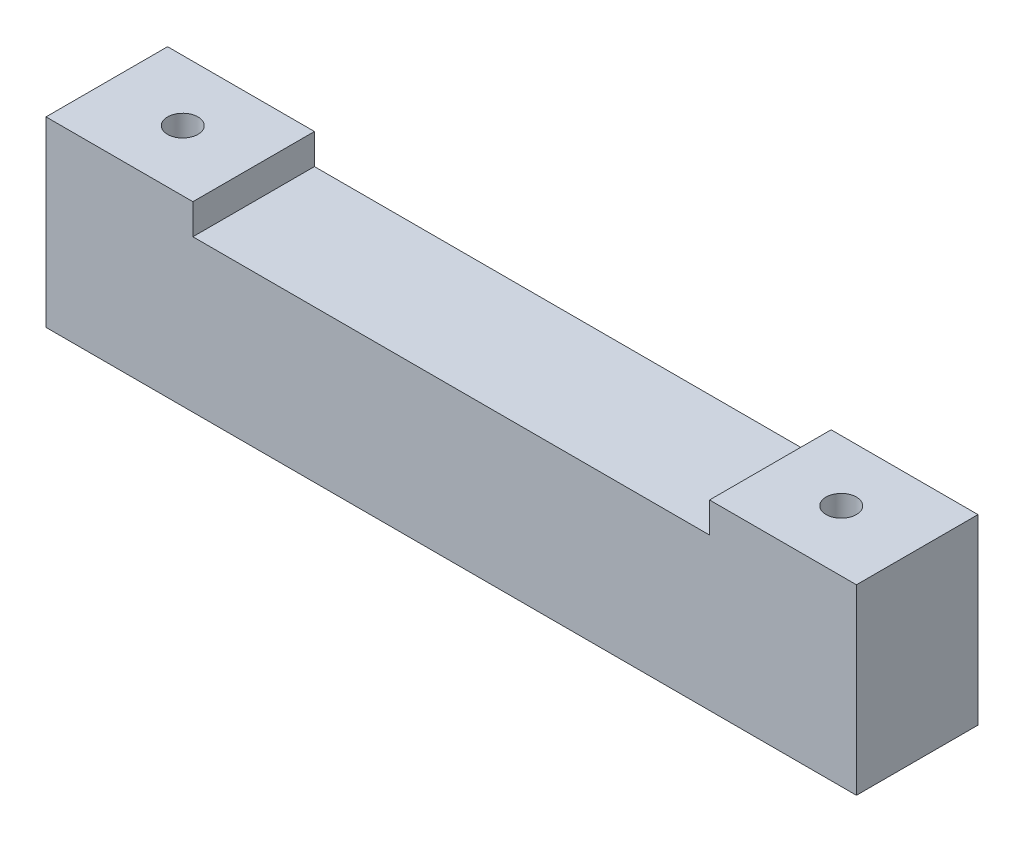
ISO-10303-21;
HEADER;
FILE_DESCRIPTION(('STEP AP214'),'2;1');
FILE_NAME('part.step','',(''),(''),'','','');
FILE_SCHEMA(('AUTOMOTIVE_DESIGN { 1 0 10303 214 1 1 1 1 }'));
ENDSEC;
DATA;
#1=APPLICATION_CONTEXT('core data for automotive mechanical design processes');
#2=APPLICATION_PROTOCOL_DEFINITION('international standard','automotive_design',2000,#1);
#3=PRODUCT_CONTEXT('',#1,'mechanical');
#4=PRODUCT('Part','Part','',(#3));
#5=PRODUCT_RELATED_PRODUCT_CATEGORY('part','',(#4));
#6=PRODUCT_DEFINITION_FORMATION('','',#4);
#7=PRODUCT_DEFINITION_CONTEXT('part definition',#1,'design');
#8=PRODUCT_DEFINITION('design','',#6,#7);
#9=PRODUCT_DEFINITION_SHAPE('','',#8);
#10=(LENGTH_UNIT() NAMED_UNIT(*) SI_UNIT(.MILLI.,.METRE.));
#11=(NAMED_UNIT(*) PLANE_ANGLE_UNIT() SI_UNIT($,.RADIAN.));
#12=(NAMED_UNIT(*) SI_UNIT($,.STERADIAN.) SOLID_ANGLE_UNIT());
#13=UNCERTAINTY_MEASURE_WITH_UNIT(LENGTH_MEASURE(1.E-05),#10,'distance_accuracy_value','');
#14=(GEOMETRIC_REPRESENTATION_CONTEXT(3) GLOBAL_UNCERTAINTY_ASSIGNED_CONTEXT((#13)) GLOBAL_UNIT_ASSIGNED_CONTEXT((#10,
#11,#12)) REPRESENTATION_CONTEXT('',''));
#15=CARTESIAN_POINT('',(0.,0.,0.));
#16=DIRECTION('',(0.,0.,1.));
#17=DIRECTION('',(1.,0.,0.));
#18=AXIS2_PLACEMENT_3D('',#15,#16,#17);
#19=CARTESIAN_POINT('',(40.,0.,12.));
#20=DIRECTION('',(-1.,0.,0.));
#21=DIRECTION('',(0.,0.,1.));
#22=AXIS2_PLACEMENT_3D('',#19,#20,#21);
#23=PLANE('',#22);
#24=DIRECTION('',(0.,1.,0.));
#25=VECTOR('',#24,1.);
#26=CARTESIAN_POINT('',(40.,0.,0.));
#27=LINE('',#26,#25);
#28=CARTESIAN_POINT('',(40.,0.,0.));
#29=VERTEX_POINT('',#28);
#30=CARTESIAN_POINT('',(40.,18.,0.));
#31=VERTEX_POINT('',#30);
#32=EDGE_CURVE('E140',#29,#31,#27,.T.);
#33=ORIENTED_EDGE('',*,*,#32,.T.);
#34=DIRECTION('',(0.,0.,-1.));
#35=VECTOR('',#34,1.);
#36=CARTESIAN_POINT('',(40.,18.,12.));
#37=LINE('',#36,#35);
#38=CARTESIAN_POINT('',(40.,18.,12.));
#39=VERTEX_POINT('',#38);
#40=EDGE_CURVE('E11',#39,#31,#37,.T.);
#41=ORIENTED_EDGE('',*,*,#40,.F.);
#42=DIRECTION('',(0.,1.,0.));
#43=VECTOR('',#42,1.);
#44=CARTESIAN_POINT('',(40.,0.,12.));
#45=LINE('',#44,#43);
#46=CARTESIAN_POINT('',(40.,0.,12.));
#47=VERTEX_POINT('',#46);
#48=EDGE_CURVE('E163',#47,#39,#45,.T.);
#49=ORIENTED_EDGE('',*,*,#48,.F.);
#50=DIRECTION('',(0.,0.,-1.));
#51=VECTOR('',#50,1.);
#52=CARTESIAN_POINT('',(40.,0.,12.));
#53=LINE('',#52,#51);
#54=EDGE_CURVE('E136',#47,#29,#53,.T.);
#55=ORIENTED_EDGE('',*,*,#54,.T.);
#56=EDGE_LOOP('',(#33,#41,#49,#55));
#57=FACE_BOUND('',#56,.T.);
#58=ADVANCED_FACE('F39',(#57),#23,.F.);
#59=CARTESIAN_POINT('',(40.,18.,12.));
#60=DIRECTION('',(0.,-1.,0.));
#61=DIRECTION('',(0.,0.,-1.));
#62=AXIS2_PLACEMENT_3D('',#59,#60,#61);
#63=PLANE('',#62);
#64=CARTESIAN_POINT('',(32.5,18.,6.00000000000001));
#65=DIRECTION('',(0.,-1.,0.));
#66=DIRECTION('',(0.,0.,1.));
#67=AXIS2_PLACEMENT_3D('',#64,#65,#66);
#68=CIRCLE('',#67,1.5);
#69=CARTESIAN_POINT('',(32.5,18.,7.50000000000001));
#70=VERTEX_POINT('',#69);
#71=EDGE_CURVE('E211',#70,#70,#68,.T.);
#72=ORIENTED_EDGE('',*,*,#71,.T.);
#73=EDGE_LOOP('',(#72));
#74=FACE_BOUND('',#73,.T.);
#75=DIRECTION('',(-1.,0.,0.));
#76=VECTOR('',#75,1.);
#77=CARTESIAN_POINT('',(40.,18.,0.));
#78=LINE('',#77,#76);
#79=CARTESIAN_POINT('',(25.5,18.,0.));
#80=VERTEX_POINT('',#79);
#81=EDGE_CURVE('E144',#31,#80,#78,.T.);
#82=ORIENTED_EDGE('',*,*,#81,.T.);
#83=DIRECTION('',(0.,0.,-1.));
#84=VECTOR('',#83,1.);
#85=CARTESIAN_POINT('',(25.5,18.,12.));
#86=LINE('',#85,#84);
#87=CARTESIAN_POINT('',(25.5,18.,12.));
#88=VERTEX_POINT('',#87);
#89=EDGE_CURVE('E48',#88,#80,#86,.T.);
#90=ORIENTED_EDGE('',*,*,#89,.F.);
#91=DIRECTION('',(-1.,0.,0.));
#92=VECTOR('',#91,1.);
#93=CARTESIAN_POINT('',(40.,18.,12.));
#94=LINE('',#93,#92);
#95=EDGE_CURVE('E99',#39,#88,#94,.T.);
#96=ORIENTED_EDGE('',*,*,#95,.F.);
#97=ORIENTED_EDGE('',*,*,#40,.T.);
#98=EDGE_LOOP('',(#82,#90,#96,#97));
#99=FACE_BOUND('',#98,.T.);
#100=ADVANCED_FACE('F247',(#74,#99),#63,.F.);
#101=CARTESIAN_POINT('',(25.5,18.,12.));
#102=DIRECTION('',(1.,0.,0.));
#103=DIRECTION('',(0.,0.,-1.));
#104=AXIS2_PLACEMENT_3D('',#101,#102,#103);
#105=PLANE('',#104);
#106=DIRECTION('',(0.,-1.,0.));
#107=VECTOR('',#106,1.);
#108=CARTESIAN_POINT('',(25.5,18.,0.));
#109=LINE('',#108,#107);
#110=CARTESIAN_POINT('',(25.5,15.,0.));
#111=VERTEX_POINT('',#110);
#112=EDGE_CURVE('E148',#80,#111,#109,.T.);
#113=ORIENTED_EDGE('',*,*,#112,.T.);
#114=DIRECTION('',(0.,0.,-1.));
#115=VECTOR('',#114,1.);
#116=CARTESIAN_POINT('',(25.5,15.,12.));
#117=LINE('',#116,#115);
#118=CARTESIAN_POINT('',(25.5,15.,12.));
#119=VERTEX_POINT('',#118);
#120=EDGE_CURVE('E174',#119,#111,#117,.T.);
#121=ORIENTED_EDGE('',*,*,#120,.F.);
#122=DIRECTION('',(0.,-1.,0.));
#123=VECTOR('',#122,1.);
#124=CARTESIAN_POINT('',(25.5,18.,12.));
#125=LINE('',#124,#123);
#126=EDGE_CURVE('E184',#88,#119,#125,.T.);
#127=ORIENTED_EDGE('',*,*,#126,.F.);
#128=ORIENTED_EDGE('',*,*,#89,.T.);
#129=EDGE_LOOP('',(#113,#121,#127,#128));
#130=FACE_BOUND('',#129,.T.);
#131=ADVANCED_FACE('F182',(#130),#105,.F.);
#132=CARTESIAN_POINT('',(-25.5,15.,12.));
#133=DIRECTION('',(0.,-1.,0.));
#134=DIRECTION('',(0.,0.,-1.));
#135=AXIS2_PLACEMENT_3D('',#132,#133,#134);
#136=PLANE('',#135);
#137=DIRECTION('',(-1.,0.,0.));
#138=VECTOR('',#137,1.);
#139=CARTESIAN_POINT('',(-25.5,15.,0.));
#140=LINE('',#139,#138);
#141=CARTESIAN_POINT('',(-25.5,15.,0.));
#142=VERTEX_POINT('',#141);
#143=EDGE_CURVE('E151',#111,#142,#140,.T.);
#144=ORIENTED_EDGE('',*,*,#143,.T.);
#145=DIRECTION('',(0.,0.,-1.));
#146=VECTOR('',#145,1.);
#147=CARTESIAN_POINT('',(-25.5,15.,12.));
#148=LINE('',#147,#146);
#149=CARTESIAN_POINT('',(-25.5,15.,12.));
#150=VERTEX_POINT('',#149);
#151=EDGE_CURVE('E170',#150,#142,#148,.T.);
#152=ORIENTED_EDGE('',*,*,#151,.F.);
#153=DIRECTION('',(-1.,0.,0.));
#154=VECTOR('',#153,1.);
#155=CARTESIAN_POINT('',(-25.5,15.,12.));
#156=LINE('',#155,#154);
#157=EDGE_CURVE('E197',#119,#150,#156,.T.);
#158=ORIENTED_EDGE('',*,*,#157,.F.);
#159=ORIENTED_EDGE('',*,*,#120,.T.);
#160=EDGE_LOOP('',(#144,#152,#158,#159));
#161=FACE_BOUND('',#160,.T.);
#162=ADVANCED_FACE('F192',(#161),#136,.F.);
#163=CARTESIAN_POINT('',(-25.5,18.,12.));
#164=DIRECTION('',(-1.,0.,0.));
#165=DIRECTION('',(0.,0.,1.));
#166=AXIS2_PLACEMENT_3D('',#163,#164,#165);
#167=PLANE('',#166);
#168=DIRECTION('',(0.,1.,0.));
#169=VECTOR('',#168,1.);
#170=CARTESIAN_POINT('',(-25.5,18.,0.));
#171=LINE('',#170,#169);
#172=CARTESIAN_POINT('',(-25.5,18.,0.));
#173=VERTEX_POINT('',#172);
#174=EDGE_CURVE('E154',#142,#173,#171,.T.);
#175=ORIENTED_EDGE('',*,*,#174,.T.);
#176=DIRECTION('',(0.,0.,-1.));
#177=VECTOR('',#176,1.);
#178=CARTESIAN_POINT('',(-25.5,18.,12.));
#179=LINE('',#178,#177);
#180=CARTESIAN_POINT('',(-25.5,18.,12.));
#181=VERTEX_POINT('',#180);
#182=EDGE_CURVE('E129',#181,#173,#179,.T.);
#183=ORIENTED_EDGE('',*,*,#182,.F.);
#184=DIRECTION('',(0.,1.,0.));
#185=VECTOR('',#184,1.);
#186=CARTESIAN_POINT('',(-25.5,18.,12.));
#187=LINE('',#186,#185);
#188=EDGE_CURVE('E118',#150,#181,#187,.T.);
#189=ORIENTED_EDGE('',*,*,#188,.F.);
#190=ORIENTED_EDGE('',*,*,#151,.T.);
#191=EDGE_LOOP('',(#175,#183,#189,#190));
#192=FACE_BOUND('',#191,.T.);
#193=ADVANCED_FACE('F195',(#192),#167,.F.);
#194=CARTESIAN_POINT('',(-40.,18.,12.));
#195=DIRECTION('',(0.,-1.,0.));
#196=DIRECTION('',(0.,0.,-1.));
#197=AXIS2_PLACEMENT_3D('',#194,#195,#196);
#198=PLANE('',#197);
#199=CARTESIAN_POINT('',(-32.5,18.,6.));
#200=DIRECTION('',(0.,-1.,0.));
#201=DIRECTION('',(0.,0.,-1.));
#202=AXIS2_PLACEMENT_3D('',#199,#200,#201);
#203=CIRCLE('',#202,1.5);
#204=CARTESIAN_POINT('',(-32.5,18.,4.49999999999999));
#205=VERTEX_POINT('',#204);
#206=EDGE_CURVE('E145',#205,#205,#203,.T.);
#207=ORIENTED_EDGE('',*,*,#206,.T.);
#208=EDGE_LOOP('',(#207));
#209=FACE_BOUND('',#208,.T.);
#210=DIRECTION('',(-1.,0.,0.));
#211=VECTOR('',#210,1.);
#212=CARTESIAN_POINT('',(-40.,18.,0.));
#213=LINE('',#212,#211);
#214=CARTESIAN_POINT('',(-40.,18.,0.));
#215=VERTEX_POINT('',#214);
#216=EDGE_CURVE('E127',#173,#215,#213,.T.);
#217=ORIENTED_EDGE('',*,*,#216,.T.);
#218=DIRECTION('',(0.,0.,-1.));
#219=VECTOR('',#218,1.);
#220=CARTESIAN_POINT('',(-40.,18.,12.));
#221=LINE('',#220,#219);
#222=CARTESIAN_POINT('',(-40.,18.,12.));
#223=VERTEX_POINT('',#222);
#224=EDGE_CURVE('E124',#223,#215,#221,.T.);
#225=ORIENTED_EDGE('',*,*,#224,.F.);
#226=DIRECTION('',(-1.,0.,0.));
#227=VECTOR('',#226,1.);
#228=CARTESIAN_POINT('',(-40.,18.,12.));
#229=LINE('',#228,#227);
#230=EDGE_CURVE('E112',#181,#223,#229,.T.);
#231=ORIENTED_EDGE('',*,*,#230,.F.);
#232=ORIENTED_EDGE('',*,*,#182,.T.);
#233=EDGE_LOOP('',(#217,#225,#231,#232));
#234=FACE_BOUND('',#233,.T.);
#235=ADVANCED_FACE('F125',(#209,#234),#198,.F.);
#236=CARTESIAN_POINT('',(-40.,0.,12.));
#237=DIRECTION('',(1.,0.,0.));
#238=DIRECTION('',(0.,0.,-1.));
#239=AXIS2_PLACEMENT_3D('',#236,#237,#238);
#240=PLANE('',#239);
#241=DIRECTION('',(0.,-1.,0.));
#242=VECTOR('',#241,1.);
#243=CARTESIAN_POINT('',(-40.,0.,0.));
#244=LINE('',#243,#242);
#245=CARTESIAN_POINT('',(-40.,0.,0.));
#246=VERTEX_POINT('',#245);
#247=EDGE_CURVE('E85',#215,#246,#244,.T.);
#248=ORIENTED_EDGE('',*,*,#247,.T.);
#249=DIRECTION('',(0.,0.,-1.));
#250=VECTOR('',#249,1.);
#251=CARTESIAN_POINT('',(-40.,0.,12.));
#252=LINE('',#251,#250);
#253=CARTESIAN_POINT('',(-40.,0.,12.));
#254=VERTEX_POINT('',#253);
#255=EDGE_CURVE('E130',#254,#246,#252,.T.);
#256=ORIENTED_EDGE('',*,*,#255,.F.);
#257=DIRECTION('',(0.,-1.,0.));
#258=VECTOR('',#257,1.);
#259=CARTESIAN_POINT('',(-40.,0.,12.));
#260=LINE('',#259,#258);
#261=EDGE_CURVE('E116',#223,#254,#260,.T.);
#262=ORIENTED_EDGE('',*,*,#261,.F.);
#263=ORIENTED_EDGE('',*,*,#224,.T.);
#264=EDGE_LOOP('',(#248,#256,#262,#263));
#265=FACE_BOUND('',#264,.T.);
#266=ADVANCED_FACE('F132',(#265),#240,.F.);
#267=CARTESIAN_POINT('',(40.,0.,12.));
#268=DIRECTION('',(0.,1.,0.));
#269=DIRECTION('',(0.,0.,1.));
#270=AXIS2_PLACEMENT_3D('',#267,#268,#269);
#271=PLANE('',#270);
#272=CARTESIAN_POINT('',(-32.5,0.,6.));
#273=DIRECTION('',(0.,-1.,0.));
#274=DIRECTION('',(0.,0.,-1.));
#275=AXIS2_PLACEMENT_3D('',#272,#273,#274);
#276=CIRCLE('',#275,1.5);
#277=CARTESIAN_POINT('',(-32.5,0.,4.49999999999999));
#278=VERTEX_POINT('',#277);
#279=EDGE_CURVE('E215',#278,#278,#276,.T.);
#280=ORIENTED_EDGE('',*,*,#279,.F.);
#281=EDGE_LOOP('',(#280));
#282=FACE_BOUND('',#281,.T.);
#283=CARTESIAN_POINT('',(32.5,0.,6.00000000000001));
#284=DIRECTION('',(0.,-1.,0.));
#285=DIRECTION('',(0.,0.,1.));
#286=AXIS2_PLACEMENT_3D('',#283,#284,#285);
#287=CIRCLE('',#286,1.5);
#288=CARTESIAN_POINT('',(32.5,0.,7.50000000000001));
#289=VERTEX_POINT('',#288);
#290=EDGE_CURVE('E207',#289,#289,#287,.T.);
#291=ORIENTED_EDGE('',*,*,#290,.F.);
#292=EDGE_LOOP('',(#291));
#293=FACE_BOUND('',#292,.T.);
#294=DIRECTION('',(1.,0.,0.));
#295=VECTOR('',#294,1.);
#296=CARTESIAN_POINT('',(40.,0.,0.));
#297=LINE('',#296,#295);
#298=EDGE_CURVE('E91',#246,#29,#297,.T.);
#299=ORIENTED_EDGE('',*,*,#298,.T.);
#300=ORIENTED_EDGE('',*,*,#54,.F.);
#301=DIRECTION('',(1.,0.,0.));
#302=VECTOR('',#301,1.);
#303=CARTESIAN_POINT('',(40.,0.,12.));
#304=LINE('',#303,#302);
#305=EDGE_CURVE('E56',#254,#47,#304,.T.);
#306=ORIENTED_EDGE('',*,*,#305,.F.);
#307=ORIENTED_EDGE('',*,*,#255,.T.);
#308=EDGE_LOOP('',(#299,#300,#306,#307));
#309=FACE_BOUND('',#308,.T.);
#310=ADVANCED_FACE('F231',(#282,#293,#309),#271,.F.);
#311=CARTESIAN_POINT('',(0.,0.,12.));
#312=DIRECTION('',(0.,0.,1.));
#313=DIRECTION('',(1.,0.,0.));
#314=AXIS2_PLACEMENT_3D('',#311,#312,#313);
#315=PLANE('',#314);
#316=ORIENTED_EDGE('',*,*,#48,.T.);
#317=ORIENTED_EDGE('',*,*,#95,.T.);
#318=ORIENTED_EDGE('',*,*,#126,.T.);
#319=ORIENTED_EDGE('',*,*,#157,.T.);
#320=ORIENTED_EDGE('',*,*,#188,.T.);
#321=ORIENTED_EDGE('',*,*,#230,.T.);
#322=ORIENTED_EDGE('',*,*,#261,.T.);
#323=ORIENTED_EDGE('',*,*,#305,.T.);
#324=EDGE_LOOP('',(#316,#317,#318,#319,#320,#321,#322,#323));
#325=FACE_BOUND('',#324,.T.);
#326=ADVANCED_FACE('F114',(#325),#315,.T.);
#327=CARTESIAN_POINT('',(0.,0.,0.));
#328=DIRECTION('',(0.,0.,1.));
#329=DIRECTION('',(1.,0.,0.));
#330=AXIS2_PLACEMENT_3D('',#327,#328,#329);
#331=PLANE('',#330);
#332=ORIENTED_EDGE('',*,*,#32,.F.);
#333=ORIENTED_EDGE('',*,*,#298,.F.);
#334=ORIENTED_EDGE('',*,*,#247,.F.);
#335=ORIENTED_EDGE('',*,*,#216,.F.);
#336=ORIENTED_EDGE('',*,*,#174,.F.);
#337=ORIENTED_EDGE('',*,*,#143,.F.);
#338=ORIENTED_EDGE('',*,*,#112,.F.);
#339=ORIENTED_EDGE('',*,*,#81,.F.);
#340=EDGE_LOOP('',(#332,#333,#334,#335,#336,#337,#338,#339));
#341=FACE_BOUND('',#340,.T.);
#342=ADVANCED_FACE('F188',(#341),#331,.F.);
#343=CARTESIAN_POINT('',(32.5,18.,6.00000000000001));
#344=DIRECTION('',(0.,-1.,0.));
#345=DIRECTION('',(0.,0.,-1.));
#346=AXIS2_PLACEMENT_3D('',#343,#344,#345);
#347=CYLINDRICAL_SURFACE('',#346,1.5);
#348=ORIENTED_EDGE('',*,*,#71,.F.);
#349=EDGE_LOOP('',(#348));
#350=FACE_BOUND('',#349,.T.);
#351=ORIENTED_EDGE('',*,*,#290,.T.);
#352=EDGE_LOOP('',(#351));
#353=FACE_BOUND('',#352,.T.);
#354=ADVANCED_FACE('F227',(#350,#353),#347,.F.);
#355=CARTESIAN_POINT('',(-32.5,18.,6.));
#356=DIRECTION('',(0.,-1.,0.));
#357=DIRECTION('',(0.,0.,-1.));
#358=AXIS2_PLACEMENT_3D('',#355,#356,#357);
#359=CYLINDRICAL_SURFACE('',#358,1.5);
#360=ORIENTED_EDGE('',*,*,#206,.F.);
#361=EDGE_LOOP('',(#360));
#362=FACE_BOUND('',#361,.T.);
#363=ORIENTED_EDGE('',*,*,#279,.T.);
#364=EDGE_LOOP('',(#363));
#365=FACE_BOUND('',#364,.T.);
#366=ADVANCED_FACE('F224',(#362,#365),#359,.F.);
#367=CLOSED_SHELL('',(#58,#100,#131,#162,#193,#235,#266,#310,#326,#342,#354,#366));
#368=MANIFOLD_SOLID_BREP('B2',#367);
#369=ADVANCED_BREP_SHAPE_REPRESENTATION('',(#18,#368),#14);
#370=SHAPE_DEFINITION_REPRESENTATION(#9,#369);
ENDSEC;
END-ISO-10303-21;
